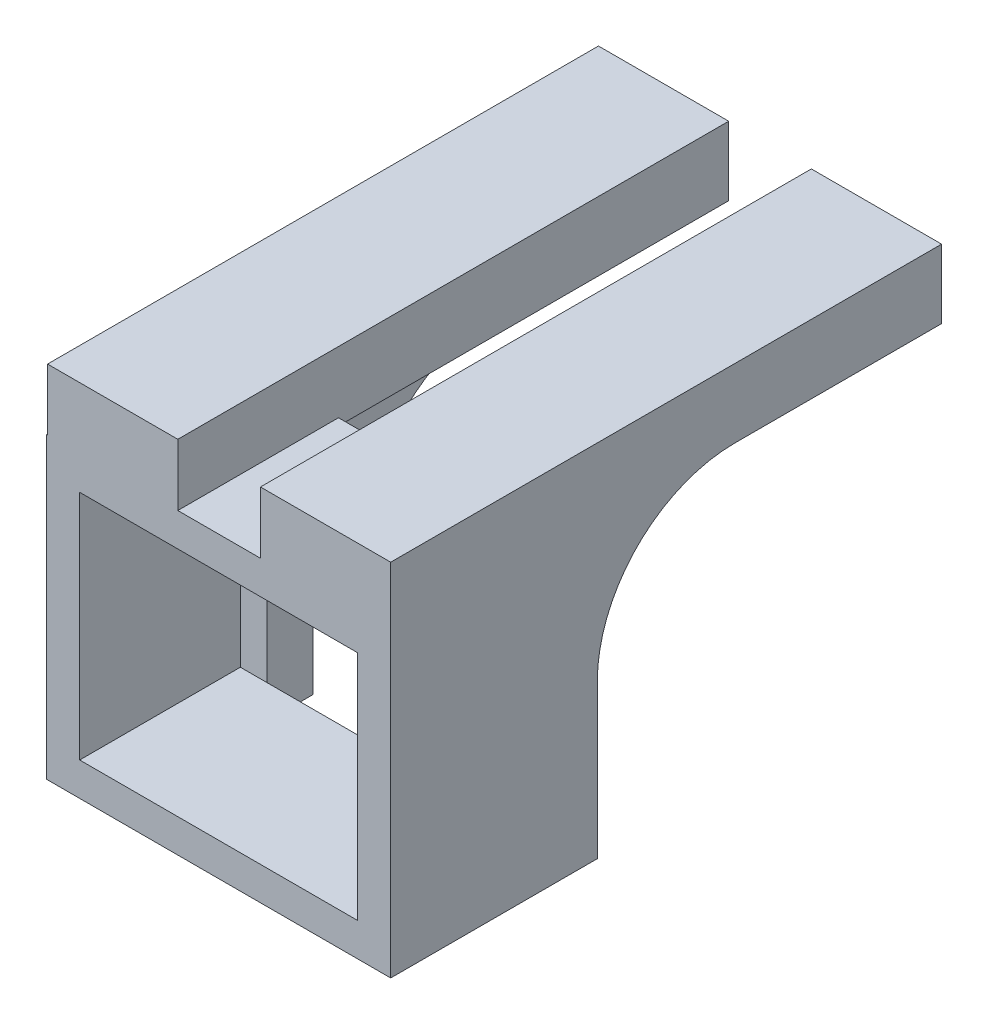
ISO-10303-21;
HEADER;
FILE_DESCRIPTION(('STEP AP214'),'2;1');
FILE_NAME('part.step','',(''),(''),'','','');
FILE_SCHEMA(('AUTOMOTIVE_DESIGN { 1 0 10303 214 1 1 1 1 }'));
ENDSEC;
DATA;
#1=APPLICATION_CONTEXT('core data for automotive mechanical design processes');
#2=APPLICATION_PROTOCOL_DEFINITION('international standard','automotive_design',2000,#1);
#3=PRODUCT_CONTEXT('',#1,'mechanical');
#4=PRODUCT('Part','Part','',(#3));
#5=PRODUCT_RELATED_PRODUCT_CATEGORY('part','',(#4));
#6=PRODUCT_DEFINITION_FORMATION('','',#4);
#7=PRODUCT_DEFINITION_CONTEXT('part definition',#1,'design');
#8=PRODUCT_DEFINITION('design','',#6,#7);
#9=PRODUCT_DEFINITION_SHAPE('','',#8);
#10=(LENGTH_UNIT() NAMED_UNIT(*) SI_UNIT(.MILLI.,.METRE.));
#11=(NAMED_UNIT(*) PLANE_ANGLE_UNIT() SI_UNIT($,.RADIAN.));
#12=(NAMED_UNIT(*) SI_UNIT($,.STERADIAN.) SOLID_ANGLE_UNIT());
#13=UNCERTAINTY_MEASURE_WITH_UNIT(LENGTH_MEASURE(1.E-05),#10,'distance_accuracy_value','');
#14=(GEOMETRIC_REPRESENTATION_CONTEXT(3) GLOBAL_UNCERTAINTY_ASSIGNED_CONTEXT((#13)) GLOBAL_UNIT_ASSIGNED_CONTEXT((#10,
#11,#12)) REPRESENTATION_CONTEXT('',''));
#15=CARTESIAN_POINT('',(0.,0.,0.));
#16=DIRECTION('',(0.,0.,1.));
#17=DIRECTION('',(1.,0.,0.));
#18=AXIS2_PLACEMENT_3D('',#15,#16,#17);
#19=CARTESIAN_POINT('',(0.,0.,0.));
#20=DIRECTION('',(0.,0.,-1.));
#21=DIRECTION('',(-1.,0.,0.));
#22=AXIS2_PLACEMENT_3D('',#19,#20,#21);
#23=PLANE('',#22);
#24=DIRECTION('',(1.,0.,0.));
#25=VECTOR('',#24,1.);
#26=CARTESIAN_POINT('',(-3.34451006267198,14.5830642535484,0.));
#27=LINE('',#26,#25);
#28=CARTESIAN_POINT('',(0.0306043962936767,14.5830642535484,0.));
#29=VERTEX_POINT('',#28);
#30=CARTESIAN_POINT('',(5.43060439629368,14.5830642535484,0.));
#31=VERTEX_POINT('',#30);
#32=EDGE_CURVE('E410',#29,#31,#27,.T.);
#33=ORIENTED_EDGE('',*,*,#32,.F.);
#34=DIRECTION('',(0.,-1.,0.));
#35=VECTOR('',#34,1.);
#36=CARTESIAN_POINT('',(0.0306043962936767,15.7215575603279,0.));
#37=LINE('',#36,#35);
#38=CARTESIAN_POINT('',(0.0306043962936767,15.7215575603279,0.));
#39=VERTEX_POINT('',#38);
#40=EDGE_CURVE('E299',#39,#29,#37,.T.);
#41=ORIENTED_EDGE('',*,*,#40,.F.);
#42=DIRECTION('',(-1.,0.,0.));
#43=VECTOR('',#42,1.);
#44=CARTESIAN_POINT('',(0.,15.7215575603279,0.));
#45=LINE('',#44,#43);
#46=CARTESIAN_POINT('',(0.930604396293676,15.7215575603279,0.));
#47=VERTEX_POINT('',#46);
#48=EDGE_CURVE('E479',#47,#39,#45,.T.);
#49=ORIENTED_EDGE('',*,*,#48,.F.);
#50=DIRECTION('',(0.,-1.,0.));
#51=VECTOR('',#50,1.);
#52=CARTESIAN_POINT('',(0.930604396293676,0.,0.));
#53=LINE('',#52,#51);
#54=CARTESIAN_POINT('',(0.930604396293676,16.0330642535484,0.));
#55=VERTEX_POINT('',#54);
#56=EDGE_CURVE('E482',#55,#47,#53,.T.);
#57=ORIENTED_EDGE('',*,*,#56,.F.);
#58=DIRECTION('',(1.,0.,0.));
#59=VECTOR('',#58,1.);
#60=CARTESIAN_POINT('',(-4.79451006267198,16.0330642535484,0.));
#61=LINE('',#60,#59);
#62=CARTESIAN_POINT('',(4.53060439629368,16.0330642535484,0.));
#63=VERTEX_POINT('',#62);
#64=EDGE_CURVE('E460',#55,#63,#61,.T.);
#65=ORIENTED_EDGE('',*,*,#64,.T.);
#66=DIRECTION('',(0.,1.,0.));
#67=VECTOR('',#66,1.);
#68=CARTESIAN_POINT('',(4.53060439629368,0.,0.));
#69=LINE('',#68,#67);
#70=CARTESIAN_POINT('',(4.53060439629368,15.7215575603279,0.));
#71=VERTEX_POINT('',#70);
#72=EDGE_CURVE('E473',#71,#63,#69,.T.);
#73=ORIENTED_EDGE('',*,*,#72,.F.);
#74=DIRECTION('',(-1.,0.,0.));
#75=VECTOR('',#74,1.);
#76=CARTESIAN_POINT('',(0.,15.7215575603279,0.));
#77=LINE('',#76,#75);
#78=CARTESIAN_POINT('',(5.43060439629368,15.7215575603279,0.));
#79=VERTEX_POINT('',#78);
#80=EDGE_CURVE('E471',#79,#71,#77,.T.);
#81=ORIENTED_EDGE('',*,*,#80,.F.);
#82=DIRECTION('',(0.,1.,0.));
#83=VECTOR('',#82,1.);
#84=CARTESIAN_POINT('',(5.43060439629368,15.7215575603279,0.));
#85=LINE('',#84,#83);
#86=EDGE_CURVE('E331',#31,#79,#85,.T.);
#87=ORIENTED_EDGE('',*,*,#86,.F.);
#88=EDGE_LOOP('',(#33,#41,#49,#57,#65,#73,#81,#87));
#89=FACE_BOUND('',#88,.T.);
#90=ADVANCED_FACE('F57',(#89),#23,.T.);
#91=DIRECTION('',(1.,0.,0.));
#92=VECTOR('',#91,1.);
#93=CARTESIAN_POINT('',(-4.79451006267198,3.03306425354839,0.));
#94=LINE('',#93,#92);
#95=CARTESIAN_POINT('',(-2.18015942695523,3.03306425354839,0.));
#96=VERTEX_POINT('',#95);
#97=CARTESIAN_POINT('',(7.64136821954259,3.03306425354839,0.));
#98=VERTEX_POINT('',#97);
#99=EDGE_CURVE('E438',#96,#98,#94,.T.);
#100=ORIENTED_EDGE('',*,*,#99,.F.);
#101=DIRECTION('',(0.,-1.,0.));
#102=VECTOR('',#101,1.);
#103=CARTESIAN_POINT('',(-2.18015942695523,9.62155756032788,0.));
#104=LINE('',#103,#102);
#105=CARTESIAN_POINT('',(-2.18015942695523,4.48306425354839,0.));
#106=VERTEX_POINT('',#105);
#107=EDGE_CURVE('E304',#106,#96,#104,.T.);
#108=ORIENTED_EDGE('',*,*,#107,.F.);
#109=DIRECTION('',(1.,0.,0.));
#110=VECTOR('',#109,1.);
#111=CARTESIAN_POINT('',(-3.34451006267198,4.48306425354839,0.));
#112=LINE('',#111,#110);
#113=CARTESIAN_POINT('',(7.64136821954259,4.48306425354839,0.));
#114=VERTEX_POINT('',#113);
#115=EDGE_CURVE('E430',#106,#114,#112,.T.);
#116=ORIENTED_EDGE('',*,*,#115,.T.);
#117=DIRECTION('',(0.,1.,0.));
#118=VECTOR('',#117,1.);
#119=CARTESIAN_POINT('',(7.64136821954259,9.62155756032788,0.));
#120=LINE('',#119,#118);
#121=EDGE_CURVE('E326',#98,#114,#120,.T.);
#122=ORIENTED_EDGE('',*,*,#121,.F.);
#123=EDGE_LOOP('',(#100,#108,#116,#122));
#124=FACE_BOUND('',#123,.T.);
#125=ADVANCED_FACE('F531',(#124),#23,.T.);
#126=DIRECTION('',(0.,1.,0.));
#127=VECTOR('',#126,1.);
#128=CARTESIAN_POINT('',(-4.74428114474066,0.,0.));
#129=LINE('',#128,#127);
#130=CARTESIAN_POINT('',(-4.74428114474066,3.03306425354839,0.));
#131=VERTEX_POINT('',#130);
#132=CARTESIAN_POINT('',(-4.74428114474066,16.0330642535484,0.));
#133=VERTEX_POINT('',#132);
#134=EDGE_CURVE('E476',#131,#133,#129,.T.);
#135=ORIENTED_EDGE('',*,*,#134,.F.);
#136=CARTESIAN_POINT('',(-4.79451006267198,3.03306425354839,0.));
#137=VERTEX_POINT('',#136);
#138=EDGE_CURVE('E457',#137,#131,#94,.T.);
#139=ORIENTED_EDGE('',*,*,#138,.F.);
#140=DIRECTION('',(0.,-1.,0.));
#141=VECTOR('',#140,1.);
#142=CARTESIAN_POINT('',(-4.79451006267198,16.0330642535484,0.));
#143=LINE('',#142,#141);
#144=CARTESIAN_POINT('',(-4.79451006267198,16.0330642535484,0.));
#145=VERTEX_POINT('',#144);
#146=EDGE_CURVE('E449',#145,#137,#143,.T.);
#147=ORIENTED_EDGE('',*,*,#146,.F.);
#148=EDGE_CURVE('E461',#145,#133,#61,.T.);
#149=ORIENTED_EDGE('',*,*,#148,.T.);
#150=EDGE_LOOP('',(#135,#139,#147,#149));
#151=FACE_BOUND('',#150,.T.);
#152=ADVANCED_FACE('F533',(#151),#23,.T.);
#153=CARTESIAN_POINT('',(0.930604396293676,15.7215575603279,7.));
#154=DIRECTION('',(0.,-1.,0.));
#155=DIRECTION('',(1.,0.,0.));
#156=AXIS2_PLACEMENT_3D('',#153,#154,#155);
#157=PLANE('',#156);
#158=DIRECTION('',(0.,0.,1.));
#159=VECTOR('',#158,1.);
#160=CARTESIAN_POINT('',(0.0306043962936767,15.7215575603279,-2.));
#161=LINE('',#160,#159);
#162=CARTESIAN_POINT('',(0.0306043962936767,15.7215575603279,-8.));
#163=VERTEX_POINT('',#162);
#164=EDGE_CURVE('E311',#163,#39,#161,.T.);
#165=ORIENTED_EDGE('',*,*,#164,.F.);
#166=DIRECTION('',(1.,0.,0.));
#167=VECTOR('',#166,1.);
#168=CARTESIAN_POINT('',(0.930604396293676,15.7215575603279,-8.));
#169=LINE('',#168,#167);
#170=CARTESIAN_POINT('',(-4.74428114474066,15.7215575603279,-8.));
#171=VERTEX_POINT('',#170);
#172=EDGE_CURVE('E486',#163,#171,#169,.F.);
#173=ORIENTED_EDGE('',*,*,#172,.T.);
#174=DIRECTION('',(0.,0.,-1.));
#175=VECTOR('',#174,1.);
#176=CARTESIAN_POINT('',(-4.74428114474066,15.7215575603279,7.));
#177=LINE('',#176,#175);
#178=CARTESIAN_POINT('',(-4.74428114474066,15.7215575603279,-17.));
#179=VERTEX_POINT('',#178);
#180=EDGE_CURVE('E368',#171,#179,#177,.T.);
#181=ORIENTED_EDGE('',*,*,#180,.T.);
#182=DIRECTION('',(-1.,0.,0.));
#183=VECTOR('',#182,1.);
#184=CARTESIAN_POINT('',(0.930604396293676,15.7215575603279,-17.));
#185=LINE('',#184,#183);
#186=CARTESIAN_POINT('',(0.930604396293676,15.7215575603279,-17.));
#187=VERTEX_POINT('',#186);
#188=EDGE_CURVE('E348',#187,#179,#185,.T.);
#189=ORIENTED_EDGE('',*,*,#188,.F.);
#190=DIRECTION('',(0.,0.,-1.));
#191=VECTOR('',#190,1.);
#192=CARTESIAN_POINT('',(0.930604396293676,15.7215575603279,7.));
#193=LINE('',#192,#191);
#194=EDGE_CURVE('E369',#47,#187,#193,.T.);
#195=ORIENTED_EDGE('',*,*,#194,.F.);
#196=ORIENTED_EDGE('',*,*,#48,.T.);
#197=EDGE_LOOP('',(#165,#173,#181,#189,#195,#196));
#198=FACE_BOUND('',#197,.T.);
#199=ADVANCED_FACE('F561',(#198),#157,.T.);
#200=CARTESIAN_POINT('',(4.53060439629368,15.7215575603279,7.));
#201=DIRECTION('',(0.,-1.,0.));
#202=DIRECTION('',(0.,0.,-1.));
#203=AXIS2_PLACEMENT_3D('',#200,#201,#202);
#204=PLANE('',#203);
#205=DIRECTION('',(0.,0.,-1.));
#206=VECTOR('',#205,1.);
#207=CARTESIAN_POINT('',(10.205489937328,15.7215575603279,7.));
#208=LINE('',#207,#206);
#209=CARTESIAN_POINT('',(10.205489937328,15.7215575603279,-8.));
#210=VERTEX_POINT('',#209);
#211=CARTESIAN_POINT('',(10.205489937328,15.7215575603279,-17.));
#212=VERTEX_POINT('',#211);
#213=EDGE_CURVE('E405',#210,#212,#208,.T.);
#214=ORIENTED_EDGE('',*,*,#213,.F.);
#215=DIRECTION('',(1.,0.,0.));
#216=VECTOR('',#215,1.);
#217=CARTESIAN_POINT('',(5.43060439629368,15.7215575603279,-8.));
#218=LINE('',#217,#216);
#219=CARTESIAN_POINT('',(5.43060439629368,15.7215575603279,-8.));
#220=VERTEX_POINT('',#219);
#221=EDGE_CURVE('E491',#210,#220,#218,.F.);
#222=ORIENTED_EDGE('',*,*,#221,.T.);
#223=DIRECTION('',(0.,0.,1.));
#224=VECTOR('',#223,1.);
#225=CARTESIAN_POINT('',(5.43060439629368,15.7215575603279,-2.));
#226=LINE('',#225,#224);
#227=EDGE_CURVE('E325',#220,#79,#226,.T.);
#228=ORIENTED_EDGE('',*,*,#227,.T.);
#229=ORIENTED_EDGE('',*,*,#80,.T.);
#230=DIRECTION('',(0.,0.,-1.));
#231=VECTOR('',#230,1.);
#232=CARTESIAN_POINT('',(4.53060439629368,15.7215575603279,7.));
#233=LINE('',#232,#231);
#234=CARTESIAN_POINT('',(4.53060439629368,15.7215575603279,-17.));
#235=VERTEX_POINT('',#234);
#236=EDGE_CURVE('E403',#71,#235,#233,.T.);
#237=ORIENTED_EDGE('',*,*,#236,.T.);
#238=DIRECTION('',(-1.,0.,0.));
#239=VECTOR('',#238,1.);
#240=CARTESIAN_POINT('',(4.53060439629368,15.7215575603279,-17.));
#241=LINE('',#240,#239);
#242=EDGE_CURVE('E388',#212,#235,#241,.T.);
#243=ORIENTED_EDGE('',*,*,#242,.F.);
#244=EDGE_LOOP('',(#214,#222,#228,#229,#237,#243));
#245=FACE_BOUND('',#244,.T.);
#246=ADVANCED_FACE('F558',(#245),#204,.T.);
#247=CARTESIAN_POINT('',(-4.79451006267198,16.0330642535484,7.));
#248=DIRECTION('',(0.,1.,0.));
#249=DIRECTION('',(0.,0.,1.));
#250=AXIS2_PLACEMENT_3D('',#247,#248,#249);
#251=PLANE('',#250);
#252=DIRECTION('',(0.,0.,-1.));
#253=VECTOR('',#252,1.);
#254=CARTESIAN_POINT('',(0.930604396293676,16.0330642535484,7.));
#255=LINE('',#254,#253);
#256=CARTESIAN_POINT('',(0.930604396293676,16.0330642535484,7.));
#257=VERTEX_POINT('',#256);
#258=EDGE_CURVE('E379',#257,#55,#255,.T.);
#259=ORIENTED_EDGE('',*,*,#258,.F.);
#260=DIRECTION('',(1.,0.,0.));
#261=VECTOR('',#260,1.);
#262=CARTESIAN_POINT('',(-4.79451006267198,16.0330642535484,7.));
#263=LINE('',#262,#261);
#264=CARTESIAN_POINT('',(4.53060439629368,16.0330642535484,7.));
#265=VERTEX_POINT('',#264);
#266=EDGE_CURVE('E451',#257,#265,#263,.T.);
#267=ORIENTED_EDGE('',*,*,#266,.T.);
#268=DIRECTION('',(0.,0.,1.));
#269=VECTOR('',#268,1.);
#270=CARTESIAN_POINT('',(4.53060439629368,16.0330642535484,7.));
#271=LINE('',#270,#269);
#272=EDGE_CURVE('E402',#63,#265,#271,.T.);
#273=ORIENTED_EDGE('',*,*,#272,.F.);
#274=ORIENTED_EDGE('',*,*,#64,.F.);
#275=EDGE_LOOP('',(#259,#267,#273,#274));
#276=FACE_BOUND('',#275,.T.);
#277=ADVANCED_FACE('F515',(#276),#251,.T.);
#278=CARTESIAN_POINT('',(-4.79451006267198,3.03306425354839,7.));
#279=DIRECTION('',(0.,1.,0.));
#280=DIRECTION('',(0.,0.,1.));
#281=AXIS2_PLACEMENT_3D('',#278,#279,#280);
#282=PLANE('',#281);
#283=ORIENTED_EDGE('',*,*,#138,.T.);
#284=DIRECTION('',(0.,0.,1.));
#285=VECTOR('',#284,1.);
#286=CARTESIAN_POINT('',(-4.74428114474066,3.0330642535484,-2.));
#287=LINE('',#286,#285);
#288=CARTESIAN_POINT('',(-4.74428114474066,3.0330642535484,-2.));
#289=VERTEX_POINT('',#288);
#290=EDGE_CURVE('E295',#289,#131,#287,.T.);
#291=ORIENTED_EDGE('',*,*,#290,.F.);
#292=DIRECTION('',(-1.,0.,0.));
#293=VECTOR('',#292,1.);
#294=CARTESIAN_POINT('',(-2.18015942695523,3.0330642535484,-2.));
#295=LINE('',#294,#293);
#296=CARTESIAN_POINT('',(-2.18015942695523,3.0330642535484,-2.));
#297=VERTEX_POINT('',#296);
#298=EDGE_CURVE('E293',#297,#289,#295,.T.);
#299=ORIENTED_EDGE('',*,*,#298,.F.);
#300=DIRECTION('',(0.,0.,1.));
#301=VECTOR('',#300,1.);
#302=CARTESIAN_POINT('',(-2.18015942695523,3.0330642535484,-2.));
#303=LINE('',#302,#301);
#304=EDGE_CURVE('E287',#297,#96,#303,.T.);
#305=ORIENTED_EDGE('',*,*,#304,.T.);
#306=ORIENTED_EDGE('',*,*,#99,.T.);
#307=DIRECTION('',(0.,0.,1.));
#308=VECTOR('',#307,1.);
#309=CARTESIAN_POINT('',(7.64136821954259,3.03306425354839,-2.));
#310=LINE('',#309,#308);
#311=CARTESIAN_POINT('',(7.64136821954259,3.03306425354839,-2.));
#312=VERTEX_POINT('',#311);
#313=EDGE_CURVE('E339',#312,#98,#310,.T.);
#314=ORIENTED_EDGE('',*,*,#313,.F.);
#315=DIRECTION('',(-1.,0.,0.));
#316=VECTOR('',#315,1.);
#317=CARTESIAN_POINT('',(7.64136821954259,3.03306425354839,-2.));
#318=LINE('',#317,#316);
#319=CARTESIAN_POINT('',(10.205489937328,3.03306425354839,-2.));
#320=VERTEX_POINT('',#319);
#321=EDGE_CURVE('E317',#320,#312,#318,.T.);
#322=ORIENTED_EDGE('',*,*,#321,.F.);
#323=DIRECTION('',(0.,0.,-1.));
#324=VECTOR('',#323,1.);
#325=CARTESIAN_POINT('',(10.205489937328,3.03306425354839,7.));
#326=LINE('',#325,#324);
#327=CARTESIAN_POINT('',(10.205489937328,3.03306425354839,7.));
#328=VERTEX_POINT('',#327);
#329=EDGE_CURVE('E468',#328,#320,#326,.T.);
#330=ORIENTED_EDGE('',*,*,#329,.F.);
#331=DIRECTION('',(1.,0.,0.));
#332=VECTOR('',#331,1.);
#333=CARTESIAN_POINT('',(-4.79451006267198,3.03306425354839,7.));
#334=LINE('',#333,#332);
#335=CARTESIAN_POINT('',(-4.79451006267198,3.03306425354839,7.));
#336=VERTEX_POINT('',#335);
#337=EDGE_CURVE('E445',#336,#328,#334,.T.);
#338=ORIENTED_EDGE('',*,*,#337,.F.);
#339=DIRECTION('',(0.,0.,-1.));
#340=VECTOR('',#339,1.);
#341=CARTESIAN_POINT('',(-4.79451006267198,3.03306425354839,7.));
#342=LINE('',#341,#340);
#343=EDGE_CURVE('E456',#336,#137,#342,.T.);
#344=ORIENTED_EDGE('',*,*,#343,.T.);
#345=EDGE_LOOP('',(#283,#291,#299,#305,#306,#314,#322,#330,#338,#344));
#346=FACE_BOUND('',#345,.T.);
#347=ADVANCED_FACE('F511',(#346),#282,.F.);
#348=CARTESIAN_POINT('',(10.205489937328,16.0330642535484,7.));
#349=DIRECTION('',(1.,0.,0.));
#350=DIRECTION('',(0.,0.,-1.));
#351=AXIS2_PLACEMENT_3D('',#348,#349,#350);
#352=PLANE('',#351);
#353=ORIENTED_EDGE('',*,*,#329,.T.);
#354=DIRECTION('',(0.,-1.,0.));
#355=VECTOR('',#354,1.);
#356=CARTESIAN_POINT('',(10.205489937328,15.7215575603279,-2.));
#357=LINE('',#356,#355);
#358=CARTESIAN_POINT('',(10.205489937328,9.72155756032788,-2.));
#359=VERTEX_POINT('',#358);
#360=EDGE_CURVE('E315',#359,#320,#357,.T.);
#361=ORIENTED_EDGE('',*,*,#360,.F.);
#362=CARTESIAN_POINT('',(10.205489937328,9.72155756032788,-8.));
#363=DIRECTION('',(1.,0.,0.));
#364=DIRECTION('',(0.,0.,-1.));
#365=AXIS2_PLACEMENT_3D('',#362,#363,#364);
#366=CIRCLE('',#365,6.);
#367=EDGE_CURVE('E662',#359,#210,#366,.F.);
#368=ORIENTED_EDGE('',*,*,#367,.T.);
#369=ORIENTED_EDGE('',*,*,#213,.T.);
#370=DIRECTION('',(0.,-1.,0.));
#371=VECTOR('',#370,1.);
#372=CARTESIAN_POINT('',(10.205489937328,15.7215575603279,-17.));
#373=LINE('',#372,#371);
#374=CARTESIAN_POINT('',(10.205489937328,18.7215575603279,-17.));
#375=VERTEX_POINT('',#374);
#376=EDGE_CURVE('E385',#375,#212,#373,.T.);
#377=ORIENTED_EDGE('',*,*,#376,.F.);
#378=DIRECTION('',(0.,0.,-1.));
#379=VECTOR('',#378,1.);
#380=CARTESIAN_POINT('',(10.205489937328,18.7215575603279,7.));
#381=LINE('',#380,#379);
#382=CARTESIAN_POINT('',(10.205489937328,18.7215575603279,7.));
#383=VERTEX_POINT('',#382);
#384=EDGE_CURVE('E399',#383,#375,#381,.T.);
#385=ORIENTED_EDGE('',*,*,#384,.F.);
#386=DIRECTION('',(0.,-1.,0.));
#387=VECTOR('',#386,1.);
#388=CARTESIAN_POINT('',(10.205489937328,16.0330642535484,7.));
#389=LINE('',#388,#387);
#390=EDGE_CURVE('E448',#383,#328,#389,.T.);
#391=ORIENTED_EDGE('',*,*,#390,.T.);
#392=EDGE_LOOP('',(#353,#361,#368,#369,#377,#385,#391));
#393=FACE_BOUND('',#392,.T.);
#394=ADVANCED_FACE('F514',(#393),#352,.T.);
#395=DIRECTION('',(0.,0.,1.));
#396=VECTOR('',#395,1.);
#397=CARTESIAN_POINT('',(-4.74428114474066,16.0330642535484,7.));
#398=LINE('',#397,#396);
#399=CARTESIAN_POINT('',(-4.74428114474066,16.0330642535484,7.));
#400=VERTEX_POINT('',#399);
#401=EDGE_CURVE('E371',#133,#400,#398,.T.);
#402=ORIENTED_EDGE('',*,*,#401,.F.);
#403=ORIENTED_EDGE('',*,*,#148,.F.);
#404=DIRECTION('',(0.,0.,-1.));
#405=VECTOR('',#404,1.);
#406=CARTESIAN_POINT('',(-4.79451006267198,16.0330642535484,7.));
#407=LINE('',#406,#405);
#408=CARTESIAN_POINT('',(-4.79451006267198,16.0330642535484,7.));
#409=VERTEX_POINT('',#408);
#410=EDGE_CURVE('E466',#409,#145,#407,.T.);
#411=ORIENTED_EDGE('',*,*,#410,.F.);
#412=EDGE_CURVE('E452',#409,#400,#263,.T.);
#413=ORIENTED_EDGE('',*,*,#412,.T.);
#414=EDGE_LOOP('',(#402,#403,#411,#413));
#415=FACE_BOUND('',#414,.T.);
#416=ADVANCED_FACE('F519',(#415),#251,.T.);
#417=CARTESIAN_POINT('',(-4.79451006267198,16.0330642535484,7.));
#418=DIRECTION('',(1.,0.,0.));
#419=DIRECTION('',(0.,1.,0.));
#420=AXIS2_PLACEMENT_3D('',#417,#418,#419);
#421=PLANE('',#420);
#422=ORIENTED_EDGE('',*,*,#146,.T.);
#423=ORIENTED_EDGE('',*,*,#343,.F.);
#424=DIRECTION('',(0.,-1.,0.));
#425=VECTOR('',#424,1.);
#426=CARTESIAN_POINT('',(-4.79451006267198,16.0330642535484,7.));
#427=LINE('',#426,#425);
#428=EDGE_CURVE('E454',#409,#336,#427,.T.);
#429=ORIENTED_EDGE('',*,*,#428,.F.);
#430=ORIENTED_EDGE('',*,*,#410,.T.);
#431=EDGE_LOOP('',(#422,#423,#429,#430));
#432=FACE_BOUND('',#431,.T.);
#433=ADVANCED_FACE('F523',(#432),#421,.F.);
#434=CARTESIAN_POINT('',(0.,0.,7.));
#435=DIRECTION('',(0.,0.,-1.));
#436=DIRECTION('',(-1.,0.,0.));
#437=AXIS2_PLACEMENT_3D('',#434,#435,#436);
#438=PLANE('',#437);
#439=ORIENTED_EDGE('',*,*,#266,.F.);
#440=DIRECTION('',(0.,-1.,0.));
#441=VECTOR('',#440,1.);
#442=CARTESIAN_POINT('',(0.930604396293676,15.7215575603279,7.));
#443=LINE('',#442,#441);
#444=CARTESIAN_POINT('',(0.930604396293676,18.7215575603279,7.));
#445=VERTEX_POINT('',#444);
#446=EDGE_CURVE('E365',#445,#257,#443,.T.);
#447=ORIENTED_EDGE('',*,*,#446,.F.);
#448=DIRECTION('',(1.,0.,0.));
#449=VECTOR('',#448,1.);
#450=CARTESIAN_POINT('',(0.930604396293676,18.7215575603279,7.));
#451=LINE('',#450,#449);
#452=CARTESIAN_POINT('',(-4.74428114474066,18.7215575603279,7.));
#453=VERTEX_POINT('',#452);
#454=EDGE_CURVE('E362',#453,#445,#451,.T.);
#455=ORIENTED_EDGE('',*,*,#454,.F.);
#456=DIRECTION('',(0.,1.,0.));
#457=VECTOR('',#456,1.);
#458=CARTESIAN_POINT('',(-4.74428114474066,15.7215575603279,7.));
#459=LINE('',#458,#457);
#460=EDGE_CURVE('E360',#400,#453,#459,.T.);
#461=ORIENTED_EDGE('',*,*,#460,.F.);
#462=ORIENTED_EDGE('',*,*,#412,.F.);
#463=ORIENTED_EDGE('',*,*,#428,.T.);
#464=ORIENTED_EDGE('',*,*,#337,.T.);
#465=ORIENTED_EDGE('',*,*,#390,.F.);
#466=DIRECTION('',(1.,0.,0.));
#467=VECTOR('',#466,1.);
#468=CARTESIAN_POINT('',(4.53060439629368,18.7215575603279,7.));
#469=LINE('',#468,#467);
#470=CARTESIAN_POINT('',(4.53060439629368,18.7215575603279,7.));
#471=VERTEX_POINT('',#470);
#472=EDGE_CURVE('E394',#471,#383,#469,.T.);
#473=ORIENTED_EDGE('',*,*,#472,.F.);
#474=DIRECTION('',(0.,1.,0.));
#475=VECTOR('',#474,1.);
#476=CARTESIAN_POINT('',(4.53060439629368,15.7215575603279,7.));
#477=LINE('',#476,#475);
#478=EDGE_CURVE('E397',#265,#471,#477,.T.);
#479=ORIENTED_EDGE('',*,*,#478,.F.);
#480=EDGE_LOOP('',(#439,#447,#455,#461,#462,#463,#464,#465,#473,#479));
#481=FACE_BOUND('',#480,.T.);
#482=DIRECTION('',(0.,1.,0.));
#483=VECTOR('',#482,1.);
#484=CARTESIAN_POINT('',(-3.34451006267198,4.48306425354839,7.));
#485=LINE('',#484,#483);
#486=CARTESIAN_POINT('',(-3.34451006267198,4.48306425354839,7.));
#487=VERTEX_POINT('',#486);
#488=CARTESIAN_POINT('',(-3.34451006267198,14.5830642535484,7.));
#489=VERTEX_POINT('',#488);
#490=EDGE_CURVE('E420',#487,#489,#485,.T.);
#491=ORIENTED_EDGE('',*,*,#490,.T.);
#492=DIRECTION('',(1.,0.,0.));
#493=VECTOR('',#492,1.);
#494=CARTESIAN_POINT('',(-3.34451006267198,14.5830642535484,7.));
#495=LINE('',#494,#493);
#496=CARTESIAN_POINT('',(8.75548993732802,14.5830642535484,7.));
#497=VERTEX_POINT('',#496);
#498=EDGE_CURVE('E411',#489,#497,#495,.T.);
#499=ORIENTED_EDGE('',*,*,#498,.T.);
#500=DIRECTION('',(0.,1.,0.));
#501=VECTOR('',#500,1.);
#502=CARTESIAN_POINT('',(8.75548993732802,4.48306425354839,7.));
#503=LINE('',#502,#501);
#504=CARTESIAN_POINT('',(8.75548993732802,4.48306425354839,7.));
#505=VERTEX_POINT('',#504);
#506=EDGE_CURVE('E414',#505,#497,#503,.T.);
#507=ORIENTED_EDGE('',*,*,#506,.F.);
#508=DIRECTION('',(1.,0.,0.));
#509=VECTOR('',#508,1.);
#510=CARTESIAN_POINT('',(-3.34451006267198,4.48306425354839,7.));
#511=LINE('',#510,#509);
#512=EDGE_CURVE('E417',#487,#505,#511,.T.);
#513=ORIENTED_EDGE('',*,*,#512,.F.);
#514=EDGE_LOOP('',(#491,#499,#507,#513));
#515=FACE_BOUND('',#514,.T.);
#516=ADVANCED_FACE('F527',(#481,#515),#438,.F.);
#517=CARTESIAN_POINT('',(-3.34451006267198,14.5830642535484,7.));
#518=DIRECTION('',(0.,1.,0.));
#519=DIRECTION('',(0.,0.,1.));
#520=AXIS2_PLACEMENT_3D('',#517,#518,#519);
#521=PLANE('',#520);
#522=CARTESIAN_POINT('',(-3.34451006267198,14.5830642535484,0.));
#523=VERTEX_POINT('',#522);
#524=EDGE_CURVE('E424',#523,#29,#27,.T.);
#525=ORIENTED_EDGE('',*,*,#524,.T.);
#526=ORIENTED_EDGE('',*,*,#32,.T.);
#527=DIRECTION('',(-1.,0.,0.));
#528=VECTOR('',#527,1.);
#529=CARTESIAN_POINT('',(-3.34451006267198,14.5830642535484,0.));
#530=LINE('',#529,#528);
#531=CARTESIAN_POINT('',(8.75548993732802,14.5830642535484,0.));
#532=VERTEX_POINT('',#531);
#533=EDGE_CURVE('E345',#532,#31,#530,.T.);
#534=ORIENTED_EDGE('',*,*,#533,.F.);
#535=DIRECTION('',(0.,0.,-1.));
#536=VECTOR('',#535,1.);
#537=CARTESIAN_POINT('',(8.75548993732802,14.5830642535484,7.));
#538=LINE('',#537,#536);
#539=EDGE_CURVE('E423',#497,#532,#538,.T.);
#540=ORIENTED_EDGE('',*,*,#539,.F.);
#541=ORIENTED_EDGE('',*,*,#498,.F.);
#542=DIRECTION('',(0.,0.,-1.));
#543=VECTOR('',#542,1.);
#544=CARTESIAN_POINT('',(-3.34451006267198,14.5830642535484,7.));
#545=LINE('',#544,#543);
#546=EDGE_CURVE('E436',#489,#523,#545,.T.);
#547=ORIENTED_EDGE('',*,*,#546,.T.);
#548=EDGE_LOOP('',(#525,#526,#534,#540,#541,#547));
#549=FACE_BOUND('',#548,.T.);
#550=ADVANCED_FACE('F536',(#549),#521,.F.);
#551=CARTESIAN_POINT('',(-3.34451006267198,4.48306425354839,7.));
#552=DIRECTION('',(-1.,0.,0.));
#553=DIRECTION('',(0.,0.,1.));
#554=AXIS2_PLACEMENT_3D('',#551,#552,#553);
#555=PLANE('',#554);
#556=DIRECTION('',(0.,1.,0.));
#557=VECTOR('',#556,1.);
#558=CARTESIAN_POINT('',(-3.34451006267198,4.48306425354839,0.));
#559=LINE('',#558,#557);
#560=CARTESIAN_POINT('',(-3.34451006267198,4.48306425354839,0.));
#561=VERTEX_POINT('',#560);
#562=EDGE_CURVE('E415',#561,#523,#559,.T.);
#563=ORIENTED_EDGE('',*,*,#562,.T.);
#564=ORIENTED_EDGE('',*,*,#546,.F.);
#565=ORIENTED_EDGE('',*,*,#490,.F.);
#566=DIRECTION('',(0.,0.,-1.));
#567=VECTOR('',#566,1.);
#568=CARTESIAN_POINT('',(-3.34451006267198,4.48306425354839,7.));
#569=LINE('',#568,#567);
#570=EDGE_CURVE('E439',#487,#561,#569,.T.);
#571=ORIENTED_EDGE('',*,*,#570,.T.);
#572=EDGE_LOOP('',(#563,#564,#565,#571));
#573=FACE_BOUND('',#572,.T.);
#574=ADVANCED_FACE('F540',(#573),#555,.F.);
#575=CARTESIAN_POINT('',(-3.34451006267198,4.48306425354839,7.));
#576=DIRECTION('',(0.,1.,0.));
#577=DIRECTION('',(0.,0.,1.));
#578=AXIS2_PLACEMENT_3D('',#575,#576,#577);
#579=PLANE('',#578);
#580=EDGE_CURVE('E431',#561,#106,#112,.T.);
#581=ORIENTED_EDGE('',*,*,#580,.F.);
#582=ORIENTED_EDGE('',*,*,#570,.F.);
#583=ORIENTED_EDGE('',*,*,#512,.T.);
#584=DIRECTION('',(0.,0.,-1.));
#585=VECTOR('',#584,1.);
#586=CARTESIAN_POINT('',(8.75548993732802,4.48306425354839,7.));
#587=LINE('',#586,#585);
#588=CARTESIAN_POINT('',(8.75548993732802,4.48306425354839,0.));
#589=VERTEX_POINT('',#588);
#590=EDGE_CURVE('E441',#505,#589,#587,.T.);
#591=ORIENTED_EDGE('',*,*,#590,.T.);
#592=DIRECTION('',(-1.,0.,0.));
#593=VECTOR('',#592,1.);
#594=CARTESIAN_POINT('',(-3.34451006267198,4.48306425354839,0.));
#595=LINE('',#594,#593);
#596=EDGE_CURVE('E342',#589,#114,#595,.T.);
#597=ORIENTED_EDGE('',*,*,#596,.T.);
#598=ORIENTED_EDGE('',*,*,#115,.F.);
#599=EDGE_LOOP('',(#581,#582,#583,#591,#597,#598));
#600=FACE_BOUND('',#599,.T.);
#601=ADVANCED_FACE('F546',(#600),#579,.T.);
#602=CARTESIAN_POINT('',(8.75548993732802,4.48306425354839,7.));
#603=DIRECTION('',(-1.,0.,0.));
#604=DIRECTION('',(0.,0.,1.));
#605=AXIS2_PLACEMENT_3D('',#602,#603,#604);
#606=PLANE('',#605);
#607=DIRECTION('',(0.,1.,0.));
#608=VECTOR('',#607,1.);
#609=CARTESIAN_POINT('',(8.75548993732802,4.48306425354839,0.));
#610=LINE('',#609,#608);
#611=EDGE_CURVE('E427',#589,#532,#610,.T.);
#612=ORIENTED_EDGE('',*,*,#611,.F.);
#613=ORIENTED_EDGE('',*,*,#590,.F.);
#614=ORIENTED_EDGE('',*,*,#506,.T.);
#615=ORIENTED_EDGE('',*,*,#539,.T.);
#616=EDGE_LOOP('',(#612,#613,#614,#615));
#617=FACE_BOUND('',#616,.T.);
#618=ADVANCED_FACE('F542',(#617),#606,.T.);
#619=CARTESIAN_POINT('',(4.53060439629368,18.7215575603279,7.));
#620=DIRECTION('',(0.,1.,0.));
#621=DIRECTION('',(-1.,0.,0.));
#622=AXIS2_PLACEMENT_3D('',#619,#620,#621);
#623=PLANE('',#622);
#624=ORIENTED_EDGE('',*,*,#384,.T.);
#625=DIRECTION('',(1.,0.,0.));
#626=VECTOR('',#625,1.);
#627=CARTESIAN_POINT('',(4.53060439629368,18.7215575603279,-17.));
#628=LINE('',#627,#626);
#629=CARTESIAN_POINT('',(4.53060439629368,18.7215575603279,-17.));
#630=VERTEX_POINT('',#629);
#631=EDGE_CURVE('E382',#630,#375,#628,.T.);
#632=ORIENTED_EDGE('',*,*,#631,.F.);
#633=DIRECTION('',(0.,0.,-1.));
#634=VECTOR('',#633,1.);
#635=CARTESIAN_POINT('',(4.53060439629368,18.7215575603279,7.));
#636=LINE('',#635,#634);
#637=EDGE_CURVE('E400',#471,#630,#636,.T.);
#638=ORIENTED_EDGE('',*,*,#637,.F.);
#639=ORIENTED_EDGE('',*,*,#472,.T.);
#640=EDGE_LOOP('',(#624,#632,#638,#639));
#641=FACE_BOUND('',#640,.T.);
#642=ADVANCED_FACE('F545',(#641),#623,.T.);
#643=CARTESIAN_POINT('',(4.53060439629368,15.7215575603279,7.));
#644=DIRECTION('',(-1.,0.,0.));
#645=DIRECTION('',(0.,-1.,0.));
#646=AXIS2_PLACEMENT_3D('',#643,#644,#645);
#647=PLANE('',#646);
#648=ORIENTED_EDGE('',*,*,#72,.T.);
#649=ORIENTED_EDGE('',*,*,#272,.T.);
#650=ORIENTED_EDGE('',*,*,#478,.T.);
#651=ORIENTED_EDGE('',*,*,#637,.T.);
#652=DIRECTION('',(0.,1.,0.));
#653=VECTOR('',#652,1.);
#654=CARTESIAN_POINT('',(4.53060439629368,15.7215575603279,-17.));
#655=LINE('',#654,#653);
#656=EDGE_CURVE('E391',#235,#630,#655,.T.);
#657=ORIENTED_EDGE('',*,*,#656,.F.);
#658=ORIENTED_EDGE('',*,*,#236,.F.);
#659=EDGE_LOOP('',(#648,#649,#650,#651,#657,#658));
#660=FACE_BOUND('',#659,.T.);
#661=ADVANCED_FACE('F556',(#660),#647,.T.);
#662=CARTESIAN_POINT('',(0.,0.,-17.));
#663=DIRECTION('',(0.,0.,1.));
#664=DIRECTION('',(1.,0.,0.));
#665=AXIS2_PLACEMENT_3D('',#662,#663,#664);
#666=PLANE('',#665);
#667=ORIENTED_EDGE('',*,*,#631,.T.);
#668=ORIENTED_EDGE('',*,*,#376,.T.);
#669=ORIENTED_EDGE('',*,*,#242,.T.);
#670=ORIENTED_EDGE('',*,*,#656,.T.);
#671=EDGE_LOOP('',(#667,#668,#669,#670));
#672=FACE_BOUND('',#671,.T.);
#673=ADVANCED_FACE('F565',(#672),#666,.F.);
#674=CARTESIAN_POINT('',(0.930604396293676,15.7215575603279,7.));
#675=DIRECTION('',(1.,0.,0.));
#676=DIRECTION('',(0.,0.,-1.));
#677=AXIS2_PLACEMENT_3D('',#674,#675,#676);
#678=PLANE('',#677);
#679=ORIENTED_EDGE('',*,*,#446,.T.);
#680=ORIENTED_EDGE('',*,*,#258,.T.);
#681=ORIENTED_EDGE('',*,*,#56,.T.);
#682=ORIENTED_EDGE('',*,*,#194,.T.);
#683=DIRECTION('',(0.,-1.,0.));
#684=VECTOR('',#683,1.);
#685=CARTESIAN_POINT('',(0.930604396293676,15.7215575603279,-17.));
#686=LINE('',#685,#684);
#687=CARTESIAN_POINT('',(0.930604396293676,18.7215575603279,-17.));
#688=VERTEX_POINT('',#687);
#689=EDGE_CURVE('E357',#688,#187,#686,.T.);
#690=ORIENTED_EDGE('',*,*,#689,.F.);
#691=DIRECTION('',(0.,0.,-1.));
#692=VECTOR('',#691,1.);
#693=CARTESIAN_POINT('',(0.930604396293676,18.7215575603279,7.));
#694=LINE('',#693,#692);
#695=EDGE_CURVE('E372',#445,#688,#694,.T.);
#696=ORIENTED_EDGE('',*,*,#695,.F.);
#697=EDGE_LOOP('',(#679,#680,#681,#682,#690,#696));
#698=FACE_BOUND('',#697,.T.);
#699=ADVANCED_FACE('F569',(#698),#678,.T.);
#700=CARTESIAN_POINT('',(0.930604396293676,18.7215575603279,7.));
#701=DIRECTION('',(0.,1.,0.));
#702=DIRECTION('',(-1.,0.,0.));
#703=AXIS2_PLACEMENT_3D('',#700,#701,#702);
#704=PLANE('',#703);
#705=ORIENTED_EDGE('',*,*,#695,.T.);
#706=DIRECTION('',(1.,0.,0.));
#707=VECTOR('',#706,1.);
#708=CARTESIAN_POINT('',(0.930604396293676,18.7215575603279,-17.));
#709=LINE('',#708,#707);
#710=CARTESIAN_POINT('',(-4.74428114474066,18.7215575603279,-17.));
#711=VERTEX_POINT('',#710);
#712=EDGE_CURVE('E354',#711,#688,#709,.T.);
#713=ORIENTED_EDGE('',*,*,#712,.F.);
#714=DIRECTION('',(0.,0.,-1.));
#715=VECTOR('',#714,1.);
#716=CARTESIAN_POINT('',(-4.74428114474066,18.7215575603279,7.));
#717=LINE('',#716,#715);
#718=EDGE_CURVE('E374',#453,#711,#717,.T.);
#719=ORIENTED_EDGE('',*,*,#718,.F.);
#720=ORIENTED_EDGE('',*,*,#454,.T.);
#721=EDGE_LOOP('',(#705,#713,#719,#720));
#722=FACE_BOUND('',#721,.T.);
#723=ADVANCED_FACE('F578',(#722),#704,.T.);
#724=CARTESIAN_POINT('',(-4.74428114474066,15.7215575603279,7.));
#725=DIRECTION('',(-1.,0.,0.));
#726=DIRECTION('',(0.,0.,1.));
#727=AXIS2_PLACEMENT_3D('',#724,#725,#726);
#728=PLANE('',#727);
#729=ORIENTED_EDGE('',*,*,#134,.T.);
#730=ORIENTED_EDGE('',*,*,#401,.T.);
#731=ORIENTED_EDGE('',*,*,#460,.T.);
#732=ORIENTED_EDGE('',*,*,#718,.T.);
#733=DIRECTION('',(0.,1.,0.));
#734=VECTOR('',#733,1.);
#735=CARTESIAN_POINT('',(-4.74428114474066,15.7215575603279,-17.));
#736=LINE('',#735,#734);
#737=EDGE_CURVE('E351',#179,#711,#736,.T.);
#738=ORIENTED_EDGE('',*,*,#737,.F.);
#739=ORIENTED_EDGE('',*,*,#180,.F.);
#740=CARTESIAN_POINT('',(-4.74428114474066,9.72155756032788,-8.));
#741=DIRECTION('',(-1.,0.,0.));
#742=DIRECTION('',(0.,0.,1.));
#743=AXIS2_PLACEMENT_3D('',#740,#741,#742);
#744=CIRCLE('',#743,6.);
#745=CARTESIAN_POINT('',(-4.74428114474066,9.72155756032788,-2.));
#746=VERTEX_POINT('',#745);
#747=EDGE_CURVE('E660',#171,#746,#744,.F.);
#748=ORIENTED_EDGE('',*,*,#747,.T.);
#749=DIRECTION('',(0.,1.,0.));
#750=VECTOR('',#749,1.);
#751=CARTESIAN_POINT('',(-4.74428114474066,13.7234597200253,-2.));
#752=LINE('',#751,#750);
#753=EDGE_CURVE('E277',#289,#746,#752,.T.);
#754=ORIENTED_EDGE('',*,*,#753,.F.);
#755=ORIENTED_EDGE('',*,*,#290,.T.);
#756=EDGE_LOOP('',(#729,#730,#731,#732,#738,#739,#748,#754,#755));
#757=FACE_BOUND('',#756,.T.);
#758=ADVANCED_FACE('F574',(#757),#728,.T.);
#759=CARTESIAN_POINT('',(0.,0.,-17.));
#760=DIRECTION('',(0.,0.,-1.));
#761=DIRECTION('',(-1.,0.,0.));
#762=AXIS2_PLACEMENT_3D('',#759,#760,#761);
#763=PLANE('',#762);
#764=ORIENTED_EDGE('',*,*,#188,.T.);
#765=ORIENTED_EDGE('',*,*,#737,.T.);
#766=ORIENTED_EDGE('',*,*,#712,.T.);
#767=ORIENTED_EDGE('',*,*,#689,.T.);
#768=EDGE_LOOP('',(#764,#765,#766,#767));
#769=FACE_BOUND('',#768,.T.);
#770=ADVANCED_FACE('F577',(#769),#763,.T.);
#771=CARTESIAN_POINT('',(2.73060439629368,9.62155756032788,0.));
#772=DIRECTION('',(0.,0.,-1.));
#773=DIRECTION('',(-1.,0.,0.));
#774=AXIS2_PLACEMENT_3D('',#771,#772,#773);
#775=PLANE('',#774);
#776=ORIENTED_EDGE('',*,*,#611,.T.);
#777=ORIENTED_EDGE('',*,*,#533,.T.);
#778=CARTESIAN_POINT('',(5.43060439629368,13.7234597200253,0.));
#779=VERTEX_POINT('',#778);
#780=EDGE_CURVE('E318',#779,#31,#85,.T.);
#781=ORIENTED_EDGE('',*,*,#780,.F.);
#782=CARTESIAN_POINT('',(2.73060439629368,9.62155756032788,0.));
#783=DIRECTION('',(0.,0.,1.));
#784=DIRECTION('',(-1.,0.,0.));
#785=AXIS2_PLACEMENT_3D('',#782,#783,#784);
#786=CIRCLE('',#785,4.91076382324891);
#787=CARTESIAN_POINT('',(7.64136821954259,9.62155756032788,0.));
#788=VERTEX_POINT('',#787);
#789=EDGE_CURVE('E329',#788,#779,#786,.T.);
#790=ORIENTED_EDGE('',*,*,#789,.F.);
#791=EDGE_CURVE('E314',#114,#788,#120,.T.);
#792=ORIENTED_EDGE('',*,*,#791,.F.);
#793=ORIENTED_EDGE('',*,*,#596,.F.);
#794=EDGE_LOOP('',(#776,#777,#781,#790,#792,#793));
#795=FACE_BOUND('',#794,.T.);
#796=ADVANCED_FACE('F588',(#795),#775,.F.);
#797=CARTESIAN_POINT('',(7.64136821954259,9.62155756032788,-2.));
#798=DIRECTION('',(1.,0.,0.));
#799=DIRECTION('',(0.,0.,-1.));
#800=AXIS2_PLACEMENT_3D('',#797,#798,#799);
#801=PLANE('',#800);
#802=ORIENTED_EDGE('',*,*,#121,.T.);
#803=ORIENTED_EDGE('',*,*,#791,.T.);
#804=DIRECTION('',(0.,0.,1.));
#805=VECTOR('',#804,1.);
#806=CARTESIAN_POINT('',(7.64136821954259,9.62155756032788,-2.));
#807=LINE('',#806,#805);
#808=CARTESIAN_POINT('',(7.64136821954259,9.62155756032788,-2.));
#809=VERTEX_POINT('',#808);
#810=EDGE_CURVE('E336',#809,#788,#807,.T.);
#811=ORIENTED_EDGE('',*,*,#810,.F.);
#812=DIRECTION('',(0.,1.,0.));
#813=VECTOR('',#812,1.);
#814=CARTESIAN_POINT('',(7.64136821954259,9.62155756032788,-2.));
#815=LINE('',#814,#813);
#816=EDGE_CURVE('E320',#312,#809,#815,.T.);
#817=ORIENTED_EDGE('',*,*,#816,.F.);
#818=ORIENTED_EDGE('',*,*,#313,.T.);
#819=EDGE_LOOP('',(#802,#803,#811,#817,#818));
#820=FACE_BOUND('',#819,.T.);
#821=ADVANCED_FACE('F590',(#820),#801,.F.);
#822=CARTESIAN_POINT('',(2.73060439629368,9.62155756032788,-2.));
#823=DIRECTION('',(0.,0.,1.));
#824=DIRECTION('',(1.,0.,0.));
#825=AXIS2_PLACEMENT_3D('',#822,#823,#824);
#826=CYLINDRICAL_SURFACE('',#825,4.91076382324891);
#827=ORIENTED_EDGE('',*,*,#789,.T.);
#828=DIRECTION('',(0.,0.,1.));
#829=VECTOR('',#828,1.);
#830=CARTESIAN_POINT('',(5.43060439629368,13.7234597200253,-2.));
#831=LINE('',#830,#829);
#832=CARTESIAN_POINT('',(5.43060439629368,13.7234597200253,-3.5295661167836));
#833=VERTEX_POINT('',#832);
#834=EDGE_CURVE('E77',#833,#779,#831,.T.);
#835=ORIENTED_EDGE('',*,*,#834,.F.);
#836=CARTESIAN_POINT('',(5.43060439629368,13.7234597200253,-3.5295661167836));
#837=CARTESIAN_POINT('',(5.55016049271751,13.6447197092201,-3.45905473540475));
#838=CARTESIAN_POINT('',(5.66603851283901,13.5609924308758,-3.38787447819845));
#839=CARTESIAN_POINT('',(5.890279871791,13.3835540238422,-3.24577469321925));
#840=CARTESIAN_POINT('',(5.99863573249647,13.289833188286,-3.17485548944928));
#841=CARTESIAN_POINT('',(6.20853678996068,13.0915156089882,-3.03428575203778));
#842=CARTESIAN_POINT('',(6.30999837216405,12.986814847711,-2.96465640574407));
#843=CARTESIAN_POINT('',(6.50416918899505,12.7675522750024,-2.82906620454796));
#844=CARTESIAN_POINT('',(6.59688215141731,12.6529947037119,-2.76310379212962));
#845=CARTESIAN_POINT('',(6.82740823614242,12.3399106605605,-2.59703116974477));
#846=CARTESIAN_POINT('',(6.95761201205161,12.1333033873371,-2.50105930216937));
#847=CARTESIAN_POINT('',(7.13022484805673,11.8065152941041,-2.37269092190845));
#848=CARTESIAN_POINT('',(7.18386285535469,11.695104723646,-2.33258940580558));
#849=CARTESIAN_POINT('',(7.28314872304579,11.4669288088737,-2.25821930483364));
#850=CARTESIAN_POINT('',(7.32880091516589,11.35016641119,-2.22394755801643));
#851=CARTESIAN_POINT('',(7.41109340777557,11.1129489163707,-2.16228475572391));
#852=CARTESIAN_POINT('',(7.44780868316729,10.992534802178,-2.13483641172174));
#853=CARTESIAN_POINT('',(7.51212200155745,10.7479164446891,-2.08712271876326));
#854=CARTESIAN_POINT('',(7.53972183585358,10.6237129512997,-2.06685595847918));
#855=CARTESIAN_POINT('',(7.58560375795674,10.370759952482,-2.03384611820658));
#856=CARTESIAN_POINT('',(7.60374914654064,10.2419710585921,-2.02121301653837));
#857=CARTESIAN_POINT('',(7.62981742007119,9.9826883016982,-2.00426449146309));
#858=CARTESIAN_POINT('',(7.63772948682012,9.85219278144499,-1.99995786805099));
#859=CARTESIAN_POINT('',(7.64034994242234,9.72155756032788,-2.));
#860=B_SPLINE_CURVE_WITH_KNOTS('',3,(#836,#837,#838,#839,#840,#841,#842,#843,#844,#845,#846,
#847,#848,#849,#850,#851,#852,#853,#854,#855,#856,#857,#858,#859),.UNSPECIFIED.,.F.,.F.,(4,2,2,
2,2,2,2,2,2,2,2,4),(0.,0.478615844896598,0.957700884668525,1.44182455955288,1.92574100849637,
2.70921808686654,3.09880465941352,3.48817924969016,3.87416500832108,4.26007487074939,
4.65141963555281,5.04317777482023),.UNSPECIFIED.);
#861=CARTESIAN_POINT('',(7.64034994242234,9.72155756032788,-2.));
#862=VERTEX_POINT('',#861);
#863=EDGE_CURVE('E12',#833,#862,#860,.T.);
#864=ORIENTED_EDGE('',*,*,#863,.T.);
#865=CARTESIAN_POINT('',(2.73060439629368,9.62155756032788,-2.));
#866=DIRECTION('',(0.,0.,1.));
#867=DIRECTION('',(-1.,0.,0.));
#868=AXIS2_PLACEMENT_3D('',#865,#866,#867);
#869=CIRCLE('',#868,4.91076382324891);
#870=EDGE_CURVE('E322',#809,#862,#869,.T.);
#871=ORIENTED_EDGE('',*,*,#870,.F.);
#872=ORIENTED_EDGE('',*,*,#810,.T.);
#873=EDGE_LOOP('',(#827,#835,#864,#871,#872));
#874=FACE_BOUND('',#873,.T.);
#875=ADVANCED_FACE('F592',(#874),#826,.F.);
#876=CARTESIAN_POINT('',(5.43060439629368,15.7215575603279,-2.));
#877=DIRECTION('',(1.,0.,0.));
#878=DIRECTION('',(0.,0.,-1.));
#879=AXIS2_PLACEMENT_3D('',#876,#877,#878);
#880=PLANE('',#879);
#881=ORIENTED_EDGE('',*,*,#780,.T.);
#882=ORIENTED_EDGE('',*,*,#86,.T.);
#883=ORIENTED_EDGE('',*,*,#227,.F.);
#884=CARTESIAN_POINT('',(5.43060439629368,9.72155756032788,-8.));
#885=DIRECTION('',(1.,0.,0.));
#886=DIRECTION('',(0.,0.,-1.));
#887=AXIS2_PLACEMENT_3D('',#884,#885,#886);
#888=CIRCLE('',#887,6.);
#889=EDGE_CURVE('E71',#220,#833,#888,.T.);
#890=ORIENTED_EDGE('',*,*,#889,.T.);
#891=ORIENTED_EDGE('',*,*,#834,.T.);
#892=EDGE_LOOP('',(#881,#882,#883,#890,#891));
#893=FACE_BOUND('',#892,.T.);
#894=ADVANCED_FACE('F597',(#893),#880,.F.);
#895=CARTESIAN_POINT('',(2.73060439629368,9.62155756032788,-2.));
#896=DIRECTION('',(0.,0.,-1.));
#897=DIRECTION('',(-1.,0.,0.));
#898=AXIS2_PLACEMENT_3D('',#895,#896,#897);
#899=PLANE('',#898);
#900=ORIENTED_EDGE('',*,*,#870,.T.);
#901=DIRECTION('',(1.,0.,0.));
#902=VECTOR('',#901,1.);
#903=CARTESIAN_POINT('',(10.205489937328,9.72155756032788,-2.));
#904=LINE('',#903,#902);
#905=EDGE_CURVE('E488',#862,#359,#904,.T.);
#906=ORIENTED_EDGE('',*,*,#905,.T.);
#907=ORIENTED_EDGE('',*,*,#360,.T.);
#908=ORIENTED_EDGE('',*,*,#321,.T.);
#909=ORIENTED_EDGE('',*,*,#816,.T.);
#910=EDGE_LOOP('',(#900,#906,#907,#908,#909));
#911=FACE_BOUND('',#910,.T.);
#912=ADVANCED_FACE('F600',(#911),#899,.T.);
#913=CARTESIAN_POINT('',(2.73060439629368,9.62155756032788,0.));
#914=DIRECTION('',(0.,0.,1.));
#915=DIRECTION('',(1.,0.,0.));
#916=AXIS2_PLACEMENT_3D('',#913,#914,#915);
#917=PLANE('',#916);
#918=ORIENTED_EDGE('',*,*,#524,.F.);
#919=ORIENTED_EDGE('',*,*,#562,.F.);
#920=ORIENTED_EDGE('',*,*,#580,.T.);
#921=CARTESIAN_POINT('',(-2.18015942695523,9.62155756032788,0.));
#922=VERTEX_POINT('',#921);
#923=EDGE_CURVE('E305',#922,#106,#104,.T.);
#924=ORIENTED_EDGE('',*,*,#923,.F.);
#925=CARTESIAN_POINT('',(2.73060439629368,9.62155756032788,0.));
#926=DIRECTION('',(0.,0.,1.));
#927=DIRECTION('',(1.,0.,0.));
#928=AXIS2_PLACEMENT_3D('',#925,#926,#927);
#929=CIRCLE('',#928,4.91076382324891);
#930=CARTESIAN_POINT('',(0.0306043962936767,13.7234597200253,0.));
#931=VERTEX_POINT('',#930);
#932=EDGE_CURVE('E283',#931,#922,#929,.T.);
#933=ORIENTED_EDGE('',*,*,#932,.F.);
#934=EDGE_CURVE('E302',#29,#931,#37,.T.);
#935=ORIENTED_EDGE('',*,*,#934,.F.);
#936=EDGE_LOOP('',(#918,#919,#920,#924,#933,#935));
#937=FACE_BOUND('',#936,.T.);
#938=ADVANCED_FACE('F606',(#937),#917,.T.);
#939=CARTESIAN_POINT('',(0.0306043962936767,15.7215575603279,-2.));
#940=DIRECTION('',(-1.,0.,0.));
#941=DIRECTION('',(0.,0.,1.));
#942=AXIS2_PLACEMENT_3D('',#939,#940,#941);
#943=PLANE('',#942);
#944=ORIENTED_EDGE('',*,*,#40,.T.);
#945=ORIENTED_EDGE('',*,*,#934,.T.);
#946=DIRECTION('',(0.,0.,1.));
#947=VECTOR('',#946,1.);
#948=CARTESIAN_POINT('',(0.0306043962936767,13.7234597200253,-2.));
#949=LINE('',#948,#947);
#950=CARTESIAN_POINT('',(0.0306043962936767,13.7234597200253,-3.5295661167836));
#951=VERTEX_POINT('',#950);
#952=EDGE_CURVE('E85',#951,#931,#949,.T.);
#953=ORIENTED_EDGE('',*,*,#952,.F.);
#954=CARTESIAN_POINT('',(0.0306043962936767,9.72155756032788,-8.));
#955=DIRECTION('',(-1.,0.,0.));
#956=DIRECTION('',(0.,0.,1.));
#957=AXIS2_PLACEMENT_3D('',#954,#955,#956);
#958=CIRCLE('',#957,6.);
#959=EDGE_CURVE('E501',#951,#163,#958,.T.);
#960=ORIENTED_EDGE('',*,*,#959,.T.);
#961=ORIENTED_EDGE('',*,*,#164,.T.);
#962=EDGE_LOOP('',(#944,#945,#953,#960,#961));
#963=FACE_BOUND('',#962,.T.);
#964=ADVANCED_FACE('F608',(#963),#943,.F.);
#965=CARTESIAN_POINT('',(2.73060439629368,9.62155756032788,-2.));
#966=DIRECTION('',(0.,0.,1.));
#967=DIRECTION('',(1.,0.,0.));
#968=AXIS2_PLACEMENT_3D('',#965,#966,#967);
#969=CYLINDRICAL_SURFACE('',#968,4.91076382324891);
#970=ORIENTED_EDGE('',*,*,#932,.T.);
#971=DIRECTION('',(0.,0.,1.));
#972=VECTOR('',#971,1.);
#973=CARTESIAN_POINT('',(-2.18015942695523,9.62155756032788,-2.));
#974=LINE('',#973,#972);
#975=CARTESIAN_POINT('',(-2.18015942695523,9.62155756032788,-2.));
#976=VERTEX_POINT('',#975);
#977=EDGE_CURVE('E280',#976,#922,#974,.T.);
#978=ORIENTED_EDGE('',*,*,#977,.F.);
#979=CARTESIAN_POINT('',(2.73060439629368,9.62155756032788,-2.));
#980=DIRECTION('',(0.,0.,1.));
#981=DIRECTION('',(1.,0.,0.));
#982=AXIS2_PLACEMENT_3D('',#979,#980,#981);
#983=CIRCLE('',#982,4.91076382324891);
#984=CARTESIAN_POINT('',(-2.17914114983498,9.72155756032788,-2.));
#985=VERTEX_POINT('',#984);
#986=EDGE_CURVE('E266',#985,#976,#983,.T.);
#987=ORIENTED_EDGE('',*,*,#986,.F.);
#988=CARTESIAN_POINT('',(-2.17914114983498,9.72155756032788,-2.));
#989=CARTESIAN_POINT('',(-2.17675697235036,9.83996733051644,-1.9999712198168));
#990=CARTESIAN_POINT('',(-2.17003585882114,9.95826875242996,-2.00350397209223));
#991=CARTESIAN_POINT('',(-2.14815106486717,10.1935954263161,-2.01744452465962));
#992=CARTESIAN_POINT('',(-2.13299356008879,10.3106215480235,-2.0278472969654));
#993=CARTESIAN_POINT('',(-2.09462559253299,10.5415364478771,-2.05516488383672));
#994=CARTESIAN_POINT('',(-2.07148411109624,10.6554433598651,-2.07202404833678));
#995=CARTESIAN_POINT('',(-2.01749686869827,10.8803297428218,-2.11185211300733));
#996=CARTESIAN_POINT('',(-1.98665007555332,10.9913088193814,-2.13482183175875));
#997=CARTESIAN_POINT('',(-1.91780020123253,11.2093112688135,-2.18630123261804));
#998=CARTESIAN_POINT('',(-1.87981901589351,11.3163455768615,-2.2147939726009));
#999=CARTESIAN_POINT('',(-1.79712781482149,11.5262857789887,-2.27680520967089));
#1000=CARTESIAN_POINT('',(-1.75241537731066,11.6291901702555,-2.31032551556539));
#1001=CARTESIAN_POINT('',(-1.60866723035025,11.9315675396505,-2.41774354936316));
#1002=CARTESIAN_POINT('',(-1.50015767506765,12.1242789358501,-2.49839434348183));
#1003=CARTESIAN_POINT('',(-1.30016750820975,12.4305484505665,-2.64460196366175));
#1004=CARTESIAN_POINT('',(-1.21440161522375,12.5496575315243,-2.70669356172168));
#1005=CARTESIAN_POINT('',(-1.03392237604595,12.7783166316095,-2.83537002370956));
#1006=CARTESIAN_POINT('',(-0.939209163769676,12.8878667937592,-2.90195482038305));
#1007=CARTESIAN_POINT('',(-0.741654217829203,13.0971479372847,-3.0380476907291));
#1008=CARTESIAN_POINT('',(-0.63881884940275,13.1968864729255,-3.10755345567065));
#1009=CARTESIAN_POINT('',(-0.425468254038588,13.3865493923891,-3.24797560564363));
#1010=CARTESIAN_POINT('',(-0.314957729302714,13.4764796999299,-3.31889110831398));
#1011=CARTESIAN_POINT('',(-0.162966270160736,13.5895627509333,-3.4130754397662));
#1012=CARTESIAN_POINT('',(-0.124786514775606,13.6171255948502,-3.43646783241328));
#1013=CARTESIAN_POINT('',(-0.0476719340322794,13.6711246230831,-3.4831216417379));
#1014=CARTESIAN_POINT('',(-0.00873839553037374,13.6975625169726,-3.50638320686511));
#1015=CARTESIAN_POINT('',(0.0306043962936096,13.7234597200254,-3.52956611678358));
#1016=B_SPLINE_CURVE_WITH_KNOTS('',3,(#988,#989,#990,#991,#992,#993,#994,#995,#996,#997,#998,
#999,#1000,#1001,#1002,#1003,#1004,#1005,#1006,#1007,#1008,#1009,#1010,#1011,#1012,#1013,#1014,
#1015),.UNSPECIFIED.,.F.,.F.,(4,2,2,2,2,2,2,2,2,2,2,2,2,4),(0.,0.35513889738658,
0.710018165614711,1.06190504396861,1.41383908548552,1.76471016580189,2.11570778595641,
2.81906609765569,3.29664536991106,3.77421749531631,4.25141899756412,4.72833067719801,
4.88605677002522,5.04353391972455),.UNSPECIFIED.);
#1017=EDGE_CURVE('E494',#985,#951,#1016,.T.);
#1018=ORIENTED_EDGE('',*,*,#1017,.T.);
#1019=ORIENTED_EDGE('',*,*,#952,.T.);
#1020=EDGE_LOOP('',(#970,#978,#987,#1018,#1019));
#1021=FACE_BOUND('',#1020,.T.);
#1022=ADVANCED_FACE('F281',(#1021),#969,.F.);
#1023=CARTESIAN_POINT('',(-2.18015942695523,9.62155756032788,-2.));
#1024=DIRECTION('',(-1.,0.,0.));
#1025=DIRECTION('',(0.,0.,1.));
#1026=AXIS2_PLACEMENT_3D('',#1023,#1024,#1025);
#1027=PLANE('',#1026);
#1028=ORIENTED_EDGE('',*,*,#923,.T.);
#1029=ORIENTED_EDGE('',*,*,#107,.T.);
#1030=ORIENTED_EDGE('',*,*,#304,.F.);
#1031=DIRECTION('',(0.,-1.,0.));
#1032=VECTOR('',#1031,1.);
#1033=CARTESIAN_POINT('',(-2.18015942695523,9.62155756032788,-2.));
#1034=LINE('',#1033,#1032);
#1035=EDGE_CURVE('E272',#976,#297,#1034,.T.);
#1036=ORIENTED_EDGE('',*,*,#1035,.F.);
#1037=ORIENTED_EDGE('',*,*,#977,.T.);
#1038=EDGE_LOOP('',(#1028,#1029,#1030,#1036,#1037));
#1039=FACE_BOUND('',#1038,.T.);
#1040=ADVANCED_FACE('F289',(#1039),#1027,.F.);
#1041=CARTESIAN_POINT('',(2.73060439629368,9.62155756032788,-2.));
#1042=DIRECTION('',(0.,0.,1.));
#1043=DIRECTION('',(1.,0.,0.));
#1044=AXIS2_PLACEMENT_3D('',#1041,#1042,#1043);
#1045=PLANE('',#1044);
#1046=ORIENTED_EDGE('',*,*,#753,.T.);
#1047=DIRECTION('',(1.,0.,0.));
#1048=VECTOR('',#1047,1.);
#1049=CARTESIAN_POINT('',(2.73060439629368,9.72155756032788,-2.));
#1050=LINE('',#1049,#1048);
#1051=EDGE_CURVE('E275',#746,#985,#1050,.T.);
#1052=ORIENTED_EDGE('',*,*,#1051,.T.);
#1053=ORIENTED_EDGE('',*,*,#986,.T.);
#1054=ORIENTED_EDGE('',*,*,#1035,.T.);
#1055=ORIENTED_EDGE('',*,*,#298,.T.);
#1056=EDGE_LOOP('',(#1046,#1052,#1053,#1054,#1055));
#1057=FACE_BOUND('',#1056,.T.);
#1058=ADVANCED_FACE('F269',(#1057),#1045,.F.);
#1059=CARTESIAN_POINT('',(2.73060439629368,9.72155756032788,-8.));
#1060=DIRECTION('',(1.,0.,0.));
#1061=DIRECTION('',(0.,1.,0.));
#1062=AXIS2_PLACEMENT_3D('',#1059,#1060,#1061);
#1063=CYLINDRICAL_SURFACE('',#1062,6.);
#1064=ORIENTED_EDGE('',*,*,#747,.F.);
#1065=ORIENTED_EDGE('',*,*,#172,.F.);
#1066=ORIENTED_EDGE('',*,*,#959,.F.);
#1067=ORIENTED_EDGE('',*,*,#1017,.F.);
#1068=ORIENTED_EDGE('',*,*,#1051,.F.);
#1069=EDGE_LOOP('',(#1064,#1065,#1066,#1067,#1068));
#1070=FACE_BOUND('',#1069,.T.);
#1071=ADVANCED_FACE('F506',(#1070),#1063,.F.);
#1072=CARTESIAN_POINT('',(2.73060439629368,9.72155756032788,-8.));
#1073=DIRECTION('',(-1.,0.,0.));
#1074=DIRECTION('',(0.,0.,1.));
#1075=AXIS2_PLACEMENT_3D('',#1072,#1073,#1074);
#1076=CYLINDRICAL_SURFACE('',#1075,6.);
#1077=ORIENTED_EDGE('',*,*,#889,.F.);
#1078=ORIENTED_EDGE('',*,*,#221,.F.);
#1079=ORIENTED_EDGE('',*,*,#367,.F.);
#1080=ORIENTED_EDGE('',*,*,#905,.F.);
#1081=ORIENTED_EDGE('',*,*,#863,.F.);
#1082=EDGE_LOOP('',(#1077,#1078,#1079,#1080,#1081));
#1083=FACE_BOUND('',#1082,.T.);
#1084=ADVANCED_FACE('F59',(#1083),#1076,.F.);
#1085=CLOSED_SHELL('',(#90,#125,#152,#199,#246,#277,#347,#394,#416,#433,#516,#550,#574,#601,
#618,#642,#661,#673,#699,#723,#758,#770,#796,#821,#875,#894,#912,#938,#964,#1022,#1040,#1058,
#1071,#1084));
#1086=MANIFOLD_SOLID_BREP('B2',#1085);
#1087=ADVANCED_BREP_SHAPE_REPRESENTATION('',(#18,#1086),#14);
#1088=SHAPE_DEFINITION_REPRESENTATION(#9,#1087);
ENDSEC;
END-ISO-10303-21;
